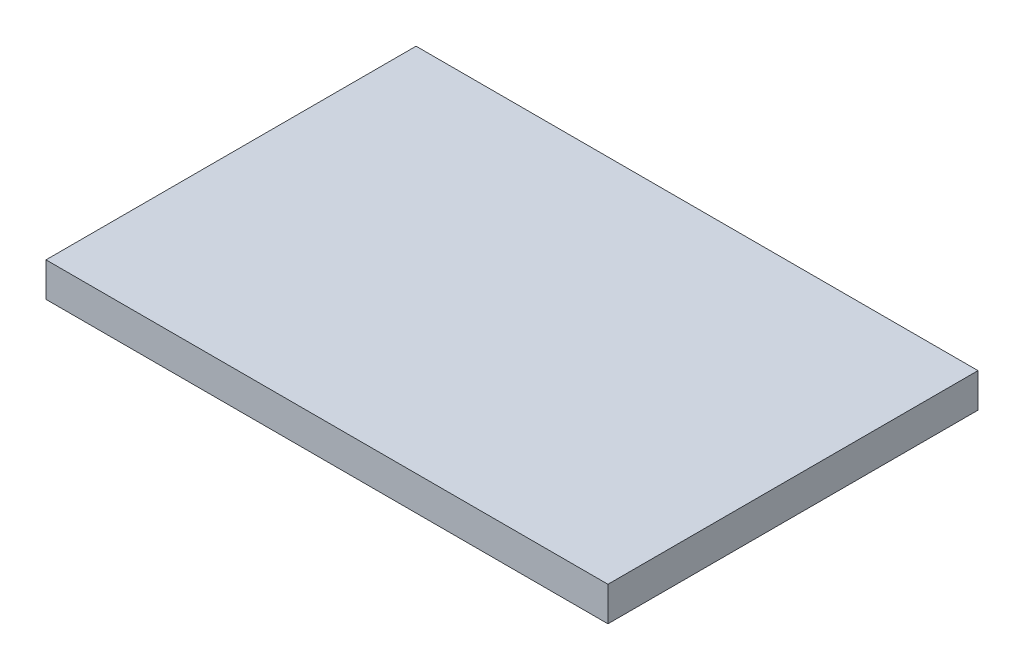
ISO-10303-21;
HEADER;
FILE_DESCRIPTION(('STEP AP214'),'2;1');
FILE_NAME('part.step','',(''),(''),'','','');
FILE_SCHEMA(('AUTOMOTIVE_DESIGN { 1 0 10303 214 1 1 1 1 }'));
ENDSEC;
DATA;
#1=APPLICATION_CONTEXT('core data for automotive mechanical design processes');
#2=APPLICATION_PROTOCOL_DEFINITION('international standard','automotive_design',2000,#1);
#3=PRODUCT_CONTEXT('',#1,'mechanical');
#4=PRODUCT('Part','Part','',(#3));
#5=PRODUCT_RELATED_PRODUCT_CATEGORY('part','',(#4));
#6=PRODUCT_DEFINITION_FORMATION('','',#4);
#7=PRODUCT_DEFINITION_CONTEXT('part definition',#1,'design');
#8=PRODUCT_DEFINITION('design','',#6,#7);
#9=PRODUCT_DEFINITION_SHAPE('','',#8);
#10=(LENGTH_UNIT() NAMED_UNIT(*) SI_UNIT(.MILLI.,.METRE.));
#11=(NAMED_UNIT(*) PLANE_ANGLE_UNIT() SI_UNIT($,.RADIAN.));
#12=(NAMED_UNIT(*) SI_UNIT($,.STERADIAN.) SOLID_ANGLE_UNIT());
#13=UNCERTAINTY_MEASURE_WITH_UNIT(LENGTH_MEASURE(1.E-05),#10,'distance_accuracy_value','');
#14=(GEOMETRIC_REPRESENTATION_CONTEXT(3) GLOBAL_UNCERTAINTY_ASSIGNED_CONTEXT((#13)) GLOBAL_UNIT_ASSIGNED_CONTEXT((#10,
#11,#12)) REPRESENTATION_CONTEXT('',''));
#15=CARTESIAN_POINT('',(0.,0.,0.));
#16=DIRECTION('',(0.,0.,1.));
#17=DIRECTION('',(1.,0.,0.));
#18=AXIS2_PLACEMENT_3D('',#15,#16,#17);
#19=CARTESIAN_POINT('',(0.,10.,0.));
#20=DIRECTION('',(1.,0.,0.));
#21=DIRECTION('',(0.,0.,-1.));
#22=AXIS2_PLACEMENT_3D('',#19,#20,#21);
#23=PLANE('',#22);
#24=DIRECTION('',(0.,0.,1.));
#25=VECTOR('',#24,1.);
#26=CARTESIAN_POINT('',(0.,0.,0.));
#27=LINE('',#26,#25);
#28=CARTESIAN_POINT('',(0.,0.,-108.));
#29=VERTEX_POINT('',#28);
#30=CARTESIAN_POINT('',(0.,0.,0.));
#31=VERTEX_POINT('',#30);
#32=EDGE_CURVE('E96',#29,#31,#27,.T.);
#33=ORIENTED_EDGE('',*,*,#32,.T.);
#34=DIRECTION('',(0.,-1.,0.));
#35=VECTOR('',#34,1.);
#36=CARTESIAN_POINT('',(0.,10.,0.));
#37=LINE('',#36,#35);
#38=CARTESIAN_POINT('',(0.,10.,0.));
#39=VERTEX_POINT('',#38);
#40=EDGE_CURVE('E11',#39,#31,#37,.T.);
#41=ORIENTED_EDGE('',*,*,#40,.F.);
#42=DIRECTION('',(0.,0.,1.));
#43=VECTOR('',#42,1.);
#44=CARTESIAN_POINT('',(0.,10.,0.));
#45=LINE('',#44,#43);
#46=CARTESIAN_POINT('',(0.,10.,-108.));
#47=VERTEX_POINT('',#46);
#48=EDGE_CURVE('E84',#47,#39,#45,.T.);
#49=ORIENTED_EDGE('',*,*,#48,.F.);
#50=DIRECTION('',(0.,-1.,0.));
#51=VECTOR('',#50,1.);
#52=CARTESIAN_POINT('',(0.,10.,-108.));
#53=LINE('',#52,#51);
#54=EDGE_CURVE('E92',#47,#29,#53,.T.);
#55=ORIENTED_EDGE('',*,*,#54,.T.);
#56=EDGE_LOOP('',(#33,#41,#49,#55));
#57=FACE_BOUND('',#56,.T.);
#58=ADVANCED_FACE('F33',(#57),#23,.F.);
#59=CARTESIAN_POINT('',(0.,10.,0.));
#60=DIRECTION('',(0.,0.,-1.));
#61=DIRECTION('',(-1.,0.,0.));
#62=AXIS2_PLACEMENT_3D('',#59,#60,#61);
#63=PLANE('',#62);
#64=DIRECTION('',(1.,0.,0.));
#65=VECTOR('',#64,1.);
#66=CARTESIAN_POINT('',(0.,0.,0.));
#67=LINE('',#66,#65);
#68=CARTESIAN_POINT('',(164.,0.,0.));
#69=VERTEX_POINT('',#68);
#70=EDGE_CURVE('E88',#31,#69,#67,.T.);
#71=ORIENTED_EDGE('',*,*,#70,.T.);
#72=DIRECTION('',(0.,-1.,0.));
#73=VECTOR('',#72,1.);
#74=CARTESIAN_POINT('',(164.,10.,0.));
#75=LINE('',#74,#73);
#76=CARTESIAN_POINT('',(164.,10.,0.));
#77=VERTEX_POINT('',#76);
#78=EDGE_CURVE('E41',#77,#69,#75,.T.);
#79=ORIENTED_EDGE('',*,*,#78,.F.);
#80=DIRECTION('',(1.,0.,0.));
#81=VECTOR('',#80,1.);
#82=CARTESIAN_POINT('',(0.,10.,0.));
#83=LINE('',#82,#81);
#84=EDGE_CURVE('E79',#39,#77,#83,.T.);
#85=ORIENTED_EDGE('',*,*,#84,.F.);
#86=ORIENTED_EDGE('',*,*,#40,.T.);
#87=EDGE_LOOP('',(#71,#79,#85,#86));
#88=FACE_BOUND('',#87,.T.);
#89=ADVANCED_FACE('F87',(#88),#63,.F.);
#90=CARTESIAN_POINT('',(164.,10.,0.));
#91=DIRECTION('',(-1.,0.,0.));
#92=DIRECTION('',(0.,0.,1.));
#93=AXIS2_PLACEMENT_3D('',#90,#91,#92);
#94=PLANE('',#93);
#95=DIRECTION('',(0.,0.,-1.));
#96=VECTOR('',#95,1.);
#97=CARTESIAN_POINT('',(164.,0.,0.));
#98=LINE('',#97,#96);
#99=CARTESIAN_POINT('',(164.,0.,-108.));
#100=VERTEX_POINT('',#99);
#101=EDGE_CURVE('E66',#69,#100,#98,.T.);
#102=ORIENTED_EDGE('',*,*,#101,.T.);
#103=DIRECTION('',(0.,-1.,0.));
#104=VECTOR('',#103,1.);
#105=CARTESIAN_POINT('',(164.,10.,-108.));
#106=LINE('',#105,#104);
#107=CARTESIAN_POINT('',(164.,10.,-108.));
#108=VERTEX_POINT('',#107);
#109=EDGE_CURVE('E89',#108,#100,#106,.T.);
#110=ORIENTED_EDGE('',*,*,#109,.F.);
#111=DIRECTION('',(0.,0.,-1.));
#112=VECTOR('',#111,1.);
#113=CARTESIAN_POINT('',(164.,10.,0.));
#114=LINE('',#113,#112);
#115=EDGE_CURVE('E82',#77,#108,#114,.T.);
#116=ORIENTED_EDGE('',*,*,#115,.F.);
#117=ORIENTED_EDGE('',*,*,#78,.T.);
#118=EDGE_LOOP('',(#102,#110,#116,#117));
#119=FACE_BOUND('',#118,.T.);
#120=ADVANCED_FACE('F90',(#119),#94,.F.);
#121=CARTESIAN_POINT('',(0.,10.,-108.));
#122=DIRECTION('',(0.,0.,1.));
#123=DIRECTION('',(1.,0.,0.));
#124=AXIS2_PLACEMENT_3D('',#121,#122,#123);
#125=PLANE('',#124);
#126=DIRECTION('',(-1.,0.,0.));
#127=VECTOR('',#126,1.);
#128=CARTESIAN_POINT('',(0.,0.,-108.));
#129=LINE('',#128,#127);
#130=EDGE_CURVE('E72',#100,#29,#129,.T.);
#131=ORIENTED_EDGE('',*,*,#130,.T.);
#132=ORIENTED_EDGE('',*,*,#54,.F.);
#133=DIRECTION('',(-1.,0.,0.));
#134=VECTOR('',#133,1.);
#135=CARTESIAN_POINT('',(0.,10.,-108.));
#136=LINE('',#135,#134);
#137=EDGE_CURVE('E49',#108,#47,#136,.T.);
#138=ORIENTED_EDGE('',*,*,#137,.F.);
#139=ORIENTED_EDGE('',*,*,#109,.T.);
#140=EDGE_LOOP('',(#131,#132,#138,#139));
#141=FACE_BOUND('',#140,.T.);
#142=ADVANCED_FACE('F103',(#141),#125,.F.);
#143=CARTESIAN_POINT('',(0.,10.,0.));
#144=DIRECTION('',(0.,-1.,0.));
#145=DIRECTION('',(0.,0.,-1.));
#146=AXIS2_PLACEMENT_3D('',#143,#144,#145);
#147=PLANE('',#146);
#148=ORIENTED_EDGE('',*,*,#48,.T.);
#149=ORIENTED_EDGE('',*,*,#84,.T.);
#150=ORIENTED_EDGE('',*,*,#115,.T.);
#151=ORIENTED_EDGE('',*,*,#137,.T.);
#152=EDGE_LOOP('',(#148,#149,#150,#151));
#153=FACE_BOUND('',#152,.T.);
#154=ADVANCED_FACE('F80',(#153),#147,.F.);
#155=CARTESIAN_POINT('',(0.,0.,0.));
#156=DIRECTION('',(0.,-1.,0.));
#157=DIRECTION('',(0.,0.,-1.));
#158=AXIS2_PLACEMENT_3D('',#155,#156,#157);
#159=PLANE('',#158);
#160=ORIENTED_EDGE('',*,*,#32,.F.);
#161=ORIENTED_EDGE('',*,*,#130,.F.);
#162=ORIENTED_EDGE('',*,*,#101,.F.);
#163=ORIENTED_EDGE('',*,*,#70,.F.);
#164=EDGE_LOOP('',(#160,#161,#162,#163));
#165=FACE_BOUND('',#164,.T.);
#166=ADVANCED_FACE('F106',(#165),#159,.T.);
#167=CLOSED_SHELL('',(#58,#89,#120,#142,#154,#166));
#168=MANIFOLD_SOLID_BREP('B2',#167);
#169=ADVANCED_BREP_SHAPE_REPRESENTATION('',(#18,#168),#14);
#170=SHAPE_DEFINITION_REPRESENTATION(#9,#169);
ENDSEC;
END-ISO-10303-21;
